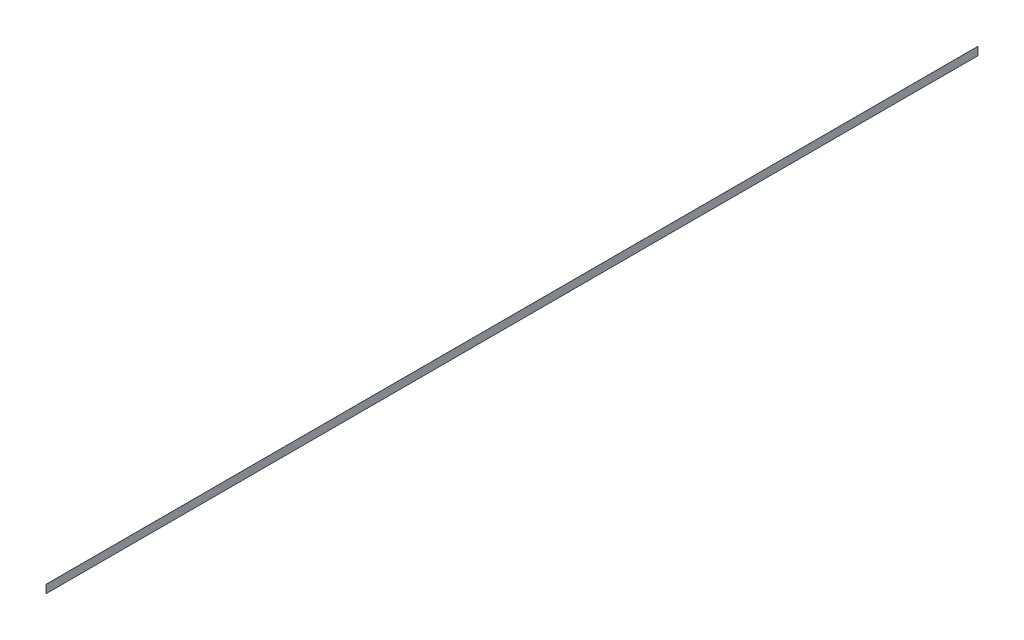
ISO-10303-21;
HEADER;
FILE_DESCRIPTION(('STEP AP214'),'2;1');
FILE_NAME('part.step','',(''),(''),'','','');
FILE_SCHEMA(('AUTOMOTIVE_DESIGN { 1 0 10303 214 1 1 1 1 }'));
ENDSEC;
DATA;
#1=APPLICATION_CONTEXT('core data for automotive mechanical design processes');
#2=APPLICATION_PROTOCOL_DEFINITION('international standard','automotive_design',2000,#1);
#3=PRODUCT_CONTEXT('',#1,'mechanical');
#4=PRODUCT('Part','Part','',(#3));
#5=PRODUCT_RELATED_PRODUCT_CATEGORY('part','',(#4));
#6=PRODUCT_DEFINITION_FORMATION('','',#4);
#7=PRODUCT_DEFINITION_CONTEXT('part definition',#1,'design');
#8=PRODUCT_DEFINITION('design','',#6,#7);
#9=PRODUCT_DEFINITION_SHAPE('','',#8);
#10=(LENGTH_UNIT() NAMED_UNIT(*) SI_UNIT(.MILLI.,.METRE.));
#11=(NAMED_UNIT(*) PLANE_ANGLE_UNIT() SI_UNIT($,.RADIAN.));
#12=(NAMED_UNIT(*) SI_UNIT($,.STERADIAN.) SOLID_ANGLE_UNIT());
#13=UNCERTAINTY_MEASURE_WITH_UNIT(LENGTH_MEASURE(1.E-05),#10,'distance_accuracy_value','');
#14=(GEOMETRIC_REPRESENTATION_CONTEXT(3) GLOBAL_UNCERTAINTY_ASSIGNED_CONTEXT((#13)) GLOBAL_UNIT_ASSIGNED_CONTEXT((#10,
#11,#12)) REPRESENTATION_CONTEXT('',''));
#15=CARTESIAN_POINT('',(0.,0.,0.));
#16=DIRECTION('',(0.,0.,1.));
#17=DIRECTION('',(1.,0.,0.));
#18=AXIS2_PLACEMENT_3D('',#15,#16,#17);
#19=CARTESIAN_POINT('',(0.100000000000001,-17.5,4000.));
#20=DIRECTION('',(-1.,0.,0.));
#21=DIRECTION('',(0.,0.,1.));
#22=AXIS2_PLACEMENT_3D('',#19,#20,#21);
#23=PLANE('',#22);
#24=DIRECTION('',(0.,1.,0.));
#25=VECTOR('',#24,1.);
#26=CARTESIAN_POINT('',(0.100000000000001,-17.5,0.));
#27=LINE('',#26,#25);
#28=CARTESIAN_POINT('',(0.100000000000001,-17.5,0.));
#29=VERTEX_POINT('',#28);
#30=CARTESIAN_POINT('',(0.100000000000001,17.5,0.));
#31=VERTEX_POINT('',#30);
#32=EDGE_CURVE('E107',#29,#31,#27,.T.);
#33=ORIENTED_EDGE('',*,*,#32,.T.);
#34=DIRECTION('',(0.,0.,-1.));
#35=VECTOR('',#34,1.);
#36=CARTESIAN_POINT('',(0.100000000000001,17.5,4000.));
#37=LINE('',#36,#35);
#38=CARTESIAN_POINT('',(0.100000000000001,17.5,4000.));
#39=VERTEX_POINT('',#38);
#40=EDGE_CURVE('E11',#39,#31,#37,.T.);
#41=ORIENTED_EDGE('',*,*,#40,.F.);
#42=DIRECTION('',(0.,1.,0.));
#43=VECTOR('',#42,1.);
#44=CARTESIAN_POINT('',(0.100000000000001,-17.5,4000.));
#45=LINE('',#44,#43);
#46=CARTESIAN_POINT('',(0.100000000000001,-17.5,4000.));
#47=VERTEX_POINT('',#46);
#48=EDGE_CURVE('E91',#47,#39,#45,.T.);
#49=ORIENTED_EDGE('',*,*,#48,.F.);
#50=DIRECTION('',(0.,0.,-1.));
#51=VECTOR('',#50,1.);
#52=CARTESIAN_POINT('',(0.100000000000001,-17.5,4000.));
#53=LINE('',#52,#51);
#54=EDGE_CURVE('E103',#47,#29,#53,.T.);
#55=ORIENTED_EDGE('',*,*,#54,.T.);
#56=EDGE_LOOP('',(#33,#41,#49,#55));
#57=FACE_BOUND('',#56,.T.);
#58=ADVANCED_FACE('F39',(#57),#23,.F.);
#59=CARTESIAN_POINT('',(-0.0999999999999998,17.5,4000.));
#60=DIRECTION('',(0.,-1.,0.));
#61=DIRECTION('',(0.,0.,-1.));
#62=AXIS2_PLACEMENT_3D('',#59,#60,#61);
#63=PLANE('',#62);
#64=DIRECTION('',(-1.,0.,0.));
#65=VECTOR('',#64,1.);
#66=CARTESIAN_POINT('',(-0.0999999999999998,17.5,0.));
#67=LINE('',#66,#65);
#68=CARTESIAN_POINT('',(-0.0999999999999998,17.5,0.));
#69=VERTEX_POINT('',#68);
#70=EDGE_CURVE('E96',#31,#69,#67,.T.);
#71=ORIENTED_EDGE('',*,*,#70,.T.);
#72=DIRECTION('',(0.,0.,-1.));
#73=VECTOR('',#72,1.);
#74=CARTESIAN_POINT('',(-0.0999999999999998,17.5,4000.));
#75=LINE('',#74,#73);
#76=CARTESIAN_POINT('',(-0.0999999999999998,17.5,4000.));
#77=VERTEX_POINT('',#76);
#78=EDGE_CURVE('E48',#77,#69,#75,.T.);
#79=ORIENTED_EDGE('',*,*,#78,.F.);
#80=DIRECTION('',(-1.,0.,0.));
#81=VECTOR('',#80,1.);
#82=CARTESIAN_POINT('',(-0.0999999999999998,17.5,4000.));
#83=LINE('',#82,#81);
#84=EDGE_CURVE('E86',#39,#77,#83,.T.);
#85=ORIENTED_EDGE('',*,*,#84,.F.);
#86=ORIENTED_EDGE('',*,*,#40,.T.);
#87=EDGE_LOOP('',(#71,#79,#85,#86));
#88=FACE_BOUND('',#87,.T.);
#89=ADVANCED_FACE('F95',(#88),#63,.F.);
#90=CARTESIAN_POINT('',(-0.0999999999999998,-17.5,4000.));
#91=DIRECTION('',(1.,0.,0.));
#92=DIRECTION('',(0.,0.,-1.));
#93=AXIS2_PLACEMENT_3D('',#90,#91,#92);
#94=PLANE('',#93);
#95=DIRECTION('',(0.,-1.,0.));
#96=VECTOR('',#95,1.);
#97=CARTESIAN_POINT('',(-0.0999999999999998,-17.5,0.));
#98=LINE('',#97,#96);
#99=CARTESIAN_POINT('',(-0.0999999999999998,-17.5,0.));
#100=VERTEX_POINT('',#99);
#101=EDGE_CURVE('E73',#69,#100,#98,.T.);
#102=ORIENTED_EDGE('',*,*,#101,.T.);
#103=DIRECTION('',(0.,0.,-1.));
#104=VECTOR('',#103,1.);
#105=CARTESIAN_POINT('',(-0.0999999999999998,-17.5,4000.));
#106=LINE('',#105,#104);
#107=CARTESIAN_POINT('',(-0.0999999999999998,-17.5,4000.));
#108=VERTEX_POINT('',#107);
#109=EDGE_CURVE('E98',#108,#100,#106,.T.);
#110=ORIENTED_EDGE('',*,*,#109,.F.);
#111=DIRECTION('',(0.,-1.,0.));
#112=VECTOR('',#111,1.);
#113=CARTESIAN_POINT('',(-0.0999999999999998,-17.5,4000.));
#114=LINE('',#113,#112);
#115=EDGE_CURVE('E89',#77,#108,#114,.T.);
#116=ORIENTED_EDGE('',*,*,#115,.F.);
#117=ORIENTED_EDGE('',*,*,#78,.T.);
#118=EDGE_LOOP('',(#102,#110,#116,#117));
#119=FACE_BOUND('',#118,.T.);
#120=ADVANCED_FACE('F99',(#119),#94,.F.);
#121=CARTESIAN_POINT('',(-0.0999999999999998,-17.5,4000.));
#122=DIRECTION('',(0.,1.,0.));
#123=DIRECTION('',(0.,0.,1.));
#124=AXIS2_PLACEMENT_3D('',#121,#122,#123);
#125=PLANE('',#124);
#126=DIRECTION('',(1.,0.,0.));
#127=VECTOR('',#126,1.);
#128=CARTESIAN_POINT('',(-0.0999999999999998,-17.5,0.));
#129=LINE('',#128,#127);
#130=EDGE_CURVE('E79',#100,#29,#129,.T.);
#131=ORIENTED_EDGE('',*,*,#130,.T.);
#132=ORIENTED_EDGE('',*,*,#54,.F.);
#133=DIRECTION('',(1.,0.,0.));
#134=VECTOR('',#133,1.);
#135=CARTESIAN_POINT('',(-0.0999999999999998,-17.5,4000.));
#136=LINE('',#135,#134);
#137=EDGE_CURVE('E56',#108,#47,#136,.T.);
#138=ORIENTED_EDGE('',*,*,#137,.F.);
#139=ORIENTED_EDGE('',*,*,#109,.T.);
#140=EDGE_LOOP('',(#131,#132,#138,#139));
#141=FACE_BOUND('',#140,.T.);
#142=ADVANCED_FACE('F120',(#141),#125,.F.);
#143=CARTESIAN_POINT('',(0.,0.,4000.));
#144=DIRECTION('',(0.,0.,-1.));
#145=DIRECTION('',(-1.,0.,0.));
#146=AXIS2_PLACEMENT_3D('',#143,#144,#145);
#147=PLANE('',#146);
#148=ORIENTED_EDGE('',*,*,#48,.T.);
#149=ORIENTED_EDGE('',*,*,#84,.T.);
#150=ORIENTED_EDGE('',*,*,#115,.T.);
#151=ORIENTED_EDGE('',*,*,#137,.T.);
#152=EDGE_LOOP('',(#148,#149,#150,#151));
#153=FACE_BOUND('',#152,.T.);
#154=ADVANCED_FACE('F87',(#153),#147,.F.);
#155=CARTESIAN_POINT('',(0.,0.,0.));
#156=DIRECTION('',(0.,0.,-1.));
#157=DIRECTION('',(-1.,0.,0.));
#158=AXIS2_PLACEMENT_3D('',#155,#156,#157);
#159=PLANE('',#158);
#160=ORIENTED_EDGE('',*,*,#32,.F.);
#161=ORIENTED_EDGE('',*,*,#130,.F.);
#162=ORIENTED_EDGE('',*,*,#101,.F.);
#163=ORIENTED_EDGE('',*,*,#70,.F.);
#164=EDGE_LOOP('',(#160,#161,#162,#163));
#165=FACE_BOUND('',#164,.T.);
#166=ADVANCED_FACE('F123',(#165),#159,.T.);
#167=CLOSED_SHELL('',(#58,#89,#120,#142,#154,#166));
#168=MANIFOLD_SOLID_BREP('B2',#167);
#169=ADVANCED_BREP_SHAPE_REPRESENTATION('',(#18,#168),#14);
#170=SHAPE_DEFINITION_REPRESENTATION(#9,#169);
ENDSEC;
END-ISO-10303-21;
